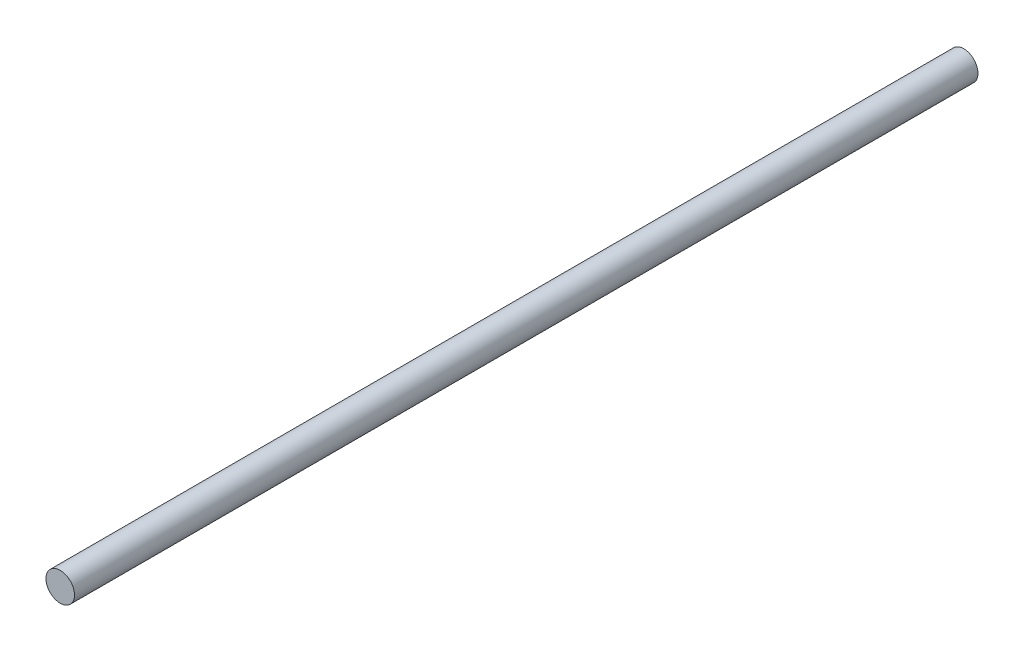
ISO-10303-21;
HEADER;
FILE_DESCRIPTION(('STEP AP214'),'2;1');
FILE_NAME('part.step','',(''),(''),'','','');
FILE_SCHEMA(('AUTOMOTIVE_DESIGN { 1 0 10303 214 1 1 1 1 }'));
ENDSEC;
DATA;
#1=APPLICATION_CONTEXT('core data for automotive mechanical design processes');
#2=APPLICATION_PROTOCOL_DEFINITION('international standard','automotive_design',2000,#1);
#3=PRODUCT_CONTEXT('',#1,'mechanical');
#4=PRODUCT('Part','Part','',(#3));
#5=PRODUCT_RELATED_PRODUCT_CATEGORY('part','',(#4));
#6=PRODUCT_DEFINITION_FORMATION('','',#4);
#7=PRODUCT_DEFINITION_CONTEXT('part definition',#1,'design');
#8=PRODUCT_DEFINITION('design','',#6,#7);
#9=PRODUCT_DEFINITION_SHAPE('','',#8);
#10=(LENGTH_UNIT() NAMED_UNIT(*) SI_UNIT(.MILLI.,.METRE.));
#11=(NAMED_UNIT(*) PLANE_ANGLE_UNIT() SI_UNIT($,.RADIAN.));
#12=(NAMED_UNIT(*) SI_UNIT($,.STERADIAN.) SOLID_ANGLE_UNIT());
#13=UNCERTAINTY_MEASURE_WITH_UNIT(LENGTH_MEASURE(1.E-05),#10,'distance_accuracy_value','');
#14=(GEOMETRIC_REPRESENTATION_CONTEXT(3) GLOBAL_UNCERTAINTY_ASSIGNED_CONTEXT((#13)) GLOBAL_UNIT_ASSIGNED_CONTEXT((#10,
#11,#12)) REPRESENTATION_CONTEXT('',''));
#15=CARTESIAN_POINT('',(0.,0.,0.));
#16=DIRECTION('',(0.,0.,1.));
#17=DIRECTION('',(1.,0.,0.));
#18=AXIS2_PLACEMENT_3D('',#15,#16,#17);
#19=CARTESIAN_POINT('',(0.,0.,190.));
#20=DIRECTION('',(0.,0.,-1.));
#21=DIRECTION('',(-1.,0.,0.));
#22=AXIS2_PLACEMENT_3D('',#19,#20,#21);
#23=CYLINDRICAL_SURFACE('',#22,3.);
#24=CARTESIAN_POINT('',(0.,0.,190.));
#25=DIRECTION('',(0.,0.,1.));
#26=DIRECTION('',(1.,0.,0.));
#27=AXIS2_PLACEMENT_3D('',#24,#25,#26);
#28=CIRCLE('',#27,3.);
#29=CARTESIAN_POINT('',(3.,0.,190.));
#30=VERTEX_POINT('',#29);
#31=EDGE_CURVE('E10',#30,#30,#28,.T.);
#32=ORIENTED_EDGE('',*,*,#31,.F.);
#33=EDGE_LOOP('',(#32));
#34=FACE_BOUND('',#33,.T.);
#35=CARTESIAN_POINT('',(0.,0.,0.));
#36=DIRECTION('',(0.,0.,1.));
#37=DIRECTION('',(1.,0.,0.));
#38=AXIS2_PLACEMENT_3D('',#35,#36,#37);
#39=CIRCLE('',#38,3.);
#40=CARTESIAN_POINT('',(3.,0.,0.));
#41=VERTEX_POINT('',#40);
#42=EDGE_CURVE('E34',#41,#41,#39,.T.);
#43=ORIENTED_EDGE('',*,*,#42,.T.);
#44=EDGE_LOOP('',(#43));
#45=FACE_BOUND('',#44,.T.);
#46=ADVANCED_FACE('F31',(#34,#45),#23,.T.);
#47=CARTESIAN_POINT('',(0.,0.,190.));
#48=DIRECTION('',(0.,0.,1.));
#49=DIRECTION('',(1.,0.,0.));
#50=AXIS2_PLACEMENT_3D('',#47,#48,#49);
#51=PLANE('',#50);
#52=ORIENTED_EDGE('',*,*,#31,.T.);
#53=EDGE_LOOP('',(#52));
#54=FACE_BOUND('',#53,.T.);
#55=ADVANCED_FACE('F46',(#54),#51,.T.);
#56=CARTESIAN_POINT('',(0.,0.,0.));
#57=DIRECTION('',(0.,0.,1.));
#58=DIRECTION('',(1.,0.,0.));
#59=AXIS2_PLACEMENT_3D('',#56,#57,#58);
#60=PLANE('',#59);
#61=ORIENTED_EDGE('',*,*,#42,.F.);
#62=EDGE_LOOP('',(#61));
#63=FACE_BOUND('',#62,.T.);
#64=ADVANCED_FACE('F44',(#63),#60,.F.);
#65=CLOSED_SHELL('',(#46,#55,#64));
#66=MANIFOLD_SOLID_BREP('B2',#65);
#67=ADVANCED_BREP_SHAPE_REPRESENTATION('',(#18,#66),#14);
#68=SHAPE_DEFINITION_REPRESENTATION(#9,#67);
ENDSEC;
END-ISO-10303-21;
